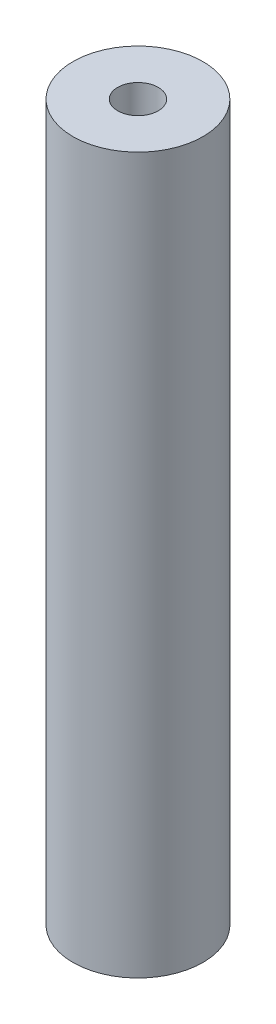
ISO-10303-21;
HEADER;
FILE_DESCRIPTION(('STEP AP214'),'2;1');
FILE_NAME('part.step','',(''),(''),'','','');
FILE_SCHEMA(('AUTOMOTIVE_DESIGN { 1 0 10303 214 1 1 1 1 }'));
ENDSEC;
DATA;
#1=APPLICATION_CONTEXT('core data for automotive mechanical design processes');
#2=APPLICATION_PROTOCOL_DEFINITION('international standard','automotive_design',2000,#1);
#3=PRODUCT_CONTEXT('',#1,'mechanical');
#4=PRODUCT('Part','Part','',(#3));
#5=PRODUCT_RELATED_PRODUCT_CATEGORY('part','',(#4));
#6=PRODUCT_DEFINITION_FORMATION('','',#4);
#7=PRODUCT_DEFINITION_CONTEXT('part definition',#1,'design');
#8=PRODUCT_DEFINITION('design','',#6,#7);
#9=PRODUCT_DEFINITION_SHAPE('','',#8);
#10=(LENGTH_UNIT() NAMED_UNIT(*) SI_UNIT(.MILLI.,.METRE.));
#11=(NAMED_UNIT(*) PLANE_ANGLE_UNIT() SI_UNIT($,.RADIAN.));
#12=(NAMED_UNIT(*) SI_UNIT($,.STERADIAN.) SOLID_ANGLE_UNIT());
#13=UNCERTAINTY_MEASURE_WITH_UNIT(LENGTH_MEASURE(1.E-05),#10,'distance_accuracy_value','');
#14=(GEOMETRIC_REPRESENTATION_CONTEXT(3) GLOBAL_UNCERTAINTY_ASSIGNED_CONTEXT((#13)) GLOBAL_UNIT_ASSIGNED_CONTEXT((#10,
#11,#12)) REPRESENTATION_CONTEXT('',''));
#15=CARTESIAN_POINT('',(0.,0.,0.));
#16=DIRECTION('',(0.,0.,1.));
#17=DIRECTION('',(1.,0.,0.));
#18=AXIS2_PLACEMENT_3D('',#15,#16,#17);
#19=CARTESIAN_POINT('',(0.,44.,0.));
#20=DIRECTION('',(0.,-1.,0.));
#21=DIRECTION('',(0.,0.,-1.));
#22=AXIS2_PLACEMENT_3D('',#19,#20,#21);
#23=CYLINDRICAL_SURFACE('',#22,4.);
#24=CARTESIAN_POINT('',(0.,44.,0.));
#25=DIRECTION('',(0.,1.,0.));
#26=DIRECTION('',(0.,0.,1.));
#27=AXIS2_PLACEMENT_3D('',#24,#25,#26);
#28=CIRCLE('',#27,4.);
#29=CARTESIAN_POINT('',(0.,44.,4.));
#30=VERTEX_POINT('',#29);
#31=EDGE_CURVE('E10',#30,#30,#28,.T.);
#32=ORIENTED_EDGE('',*,*,#31,.F.);
#33=EDGE_LOOP('',(#32));
#34=FACE_BOUND('',#33,.T.);
#35=CARTESIAN_POINT('',(0.,0.,0.));
#36=DIRECTION('',(0.,1.,0.));
#37=DIRECTION('',(0.,0.,1.));
#38=AXIS2_PLACEMENT_3D('',#35,#36,#37);
#39=CIRCLE('',#38,4.);
#40=CARTESIAN_POINT('',(0.,0.,4.));
#41=VERTEX_POINT('',#40);
#42=EDGE_CURVE('E34',#41,#41,#39,.T.);
#43=ORIENTED_EDGE('',*,*,#42,.T.);
#44=EDGE_LOOP('',(#43));
#45=FACE_BOUND('',#44,.T.);
#46=ADVANCED_FACE('F31',(#34,#45),#23,.T.);
#47=CARTESIAN_POINT('',(0.,44.,0.));
#48=DIRECTION('',(0.,1.,0.));
#49=DIRECTION('',(0.,0.,1.));
#50=AXIS2_PLACEMENT_3D('',#47,#48,#49);
#51=PLANE('',#50);
#52=CARTESIAN_POINT('',(0.,44.,0.));
#53=DIRECTION('',(0.,1.,0.));
#54=DIRECTION('',(0.,0.,1.));
#55=AXIS2_PLACEMENT_3D('',#52,#53,#54);
#56=CIRCLE('',#55,1.24999999999999);
#57=CARTESIAN_POINT('',(0.,44.,1.24999999999999));
#58=VERTEX_POINT('',#57);
#59=EDGE_CURVE('E45',#58,#58,#56,.T.);
#60=ORIENTED_EDGE('',*,*,#59,.F.);
#61=EDGE_LOOP('',(#60));
#62=FACE_BOUND('',#61,.T.);
#63=ORIENTED_EDGE('',*,*,#31,.T.);
#64=EDGE_LOOP('',(#63));
#65=FACE_BOUND('',#64,.T.);
#66=ADVANCED_FACE('F51',(#62,#65),#51,.T.);
#67=CARTESIAN_POINT('',(0.,0.,0.));
#68=DIRECTION('',(0.,1.,0.));
#69=DIRECTION('',(0.,0.,1.));
#70=AXIS2_PLACEMENT_3D('',#67,#68,#69);
#71=PLANE('',#70);
#72=CARTESIAN_POINT('',(0.,0.,0.));
#73=DIRECTION('',(0.,1.,0.));
#74=DIRECTION('',(0.,0.,1.));
#75=AXIS2_PLACEMENT_3D('',#72,#73,#74);
#76=CIRCLE('',#75,1.24999999999999);
#77=CARTESIAN_POINT('',(0.,0.,1.24999999999999));
#78=VERTEX_POINT('',#77);
#79=EDGE_CURVE('E41',#78,#78,#76,.T.);
#80=ORIENTED_EDGE('',*,*,#79,.T.);
#81=EDGE_LOOP('',(#80));
#82=FACE_BOUND('',#81,.T.);
#83=ORIENTED_EDGE('',*,*,#42,.F.);
#84=EDGE_LOOP('',(#83));
#85=FACE_BOUND('',#84,.T.);
#86=ADVANCED_FACE('F53',(#82,#85),#71,.F.);
#87=CARTESIAN_POINT('',(0.,44.,0.));
#88=DIRECTION('',(0.,1.,0.));
#89=DIRECTION('',(0.,0.,1.));
#90=AXIS2_PLACEMENT_3D('',#87,#88,#89);
#91=CYLINDRICAL_SURFACE('',#90,1.24999999999999);
#92=ORIENTED_EDGE('',*,*,#79,.F.);
#93=EDGE_LOOP('',(#92));
#94=FACE_BOUND('',#93,.T.);
#95=ORIENTED_EDGE('',*,*,#59,.T.);
#96=EDGE_LOOP('',(#95));
#97=FACE_BOUND('',#96,.T.);
#98=ADVANCED_FACE('F49',(#94,#97),#91,.F.);
#99=CLOSED_SHELL('',(#46,#66,#86,#98));
#100=MANIFOLD_SOLID_BREP('B2',#99);
#101=ADVANCED_BREP_SHAPE_REPRESENTATION('',(#18,#100),#14);
#102=SHAPE_DEFINITION_REPRESENTATION(#9,#101);
ENDSEC;
END-ISO-10303-21;
